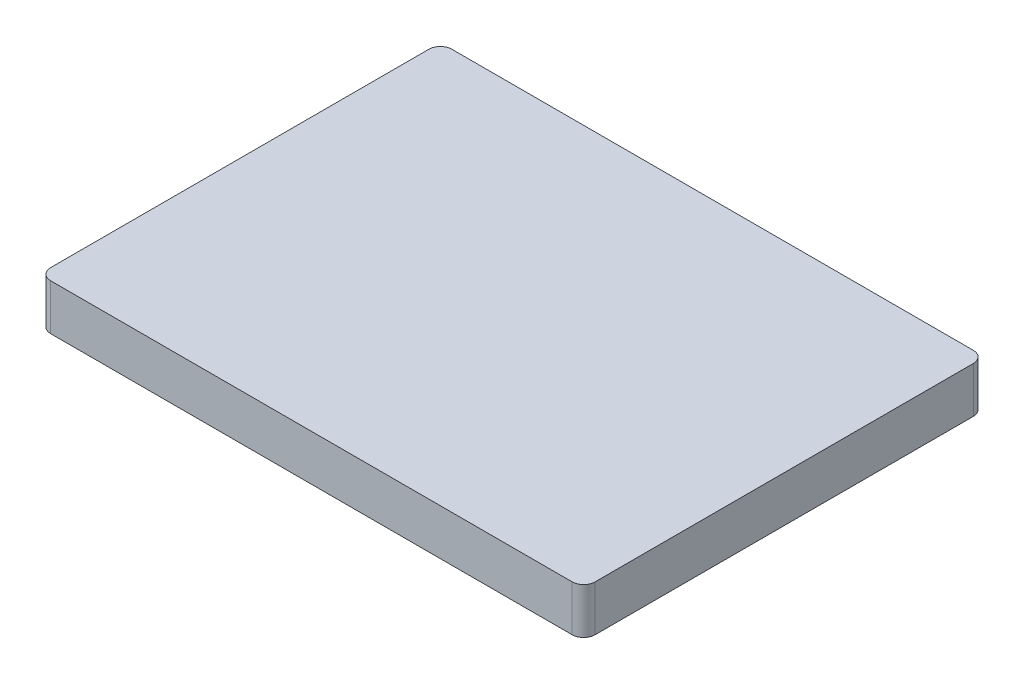
ISO-10303-21;
HEADER;
FILE_DESCRIPTION(('STEP AP214'),'2;1');
FILE_NAME('part.step','',(''),(''),'','','');
FILE_SCHEMA(('AUTOMOTIVE_DESIGN { 1 0 10303 214 1 1 1 1 }'));
ENDSEC;
DATA;
#1=APPLICATION_CONTEXT('core data for automotive mechanical design processes');
#2=APPLICATION_PROTOCOL_DEFINITION('international standard','automotive_design',2000,#1);
#3=PRODUCT_CONTEXT('',#1,'mechanical');
#4=PRODUCT('Part','Part','',(#3));
#5=PRODUCT_RELATED_PRODUCT_CATEGORY('part','',(#4));
#6=PRODUCT_DEFINITION_FORMATION('','',#4);
#7=PRODUCT_DEFINITION_CONTEXT('part definition',#1,'design');
#8=PRODUCT_DEFINITION('design','',#6,#7);
#9=PRODUCT_DEFINITION_SHAPE('','',#8);
#10=(LENGTH_UNIT() NAMED_UNIT(*) SI_UNIT(.MILLI.,.METRE.));
#11=(NAMED_UNIT(*) PLANE_ANGLE_UNIT() SI_UNIT($,.RADIAN.));
#12=(NAMED_UNIT(*) SI_UNIT($,.STERADIAN.) SOLID_ANGLE_UNIT());
#13=UNCERTAINTY_MEASURE_WITH_UNIT(LENGTH_MEASURE(1.E-05),#10,'distance_accuracy_value','');
#14=(GEOMETRIC_REPRESENTATION_CONTEXT(3) GLOBAL_UNCERTAINTY_ASSIGNED_CONTEXT((#13)) GLOBAL_UNIT_ASSIGNED_CONTEXT((#10,
#11,#12)) REPRESENTATION_CONTEXT('',''));
#15=CARTESIAN_POINT('',(0.,0.,0.));
#16=DIRECTION('',(0.,0.,1.));
#17=DIRECTION('',(1.,0.,0.));
#18=AXIS2_PLACEMENT_3D('',#15,#16,#17);
#19=CARTESIAN_POINT('',(2.,8.,-68.));
#20=DIRECTION('',(0.,-1.,0.));
#21=DIRECTION('',(0.,0.,-1.));
#22=AXIS2_PLACEMENT_3D('',#19,#20,#21);
#23=CYLINDRICAL_SURFACE('',#22,2.);
#24=CARTESIAN_POINT('',(2.,0.,-68.));
#25=DIRECTION('',(0.,1.,0.));
#26=DIRECTION('',(0.,0.,-1.));
#27=AXIS2_PLACEMENT_3D('',#24,#25,#26);
#28=CIRCLE('',#27,2.);
#29=CARTESIAN_POINT('',(2.00000000000001,0.,-70.));
#30=VERTEX_POINT('',#29);
#31=CARTESIAN_POINT('',(0.,0.,-68.));
#32=VERTEX_POINT('',#31);
#33=EDGE_CURVE('E129',#30,#32,#28,.T.);
#34=ORIENTED_EDGE('',*,*,#33,.T.);
#35=DIRECTION('',(0.,-1.,0.));
#36=VECTOR('',#35,1.);
#37=CARTESIAN_POINT('',(0.,8.,-68.));
#38=LINE('',#37,#36);
#39=CARTESIAN_POINT('',(0.,8.,-68.));
#40=VERTEX_POINT('',#39);
#41=EDGE_CURVE('E11',#40,#32,#38,.T.);
#42=ORIENTED_EDGE('',*,*,#41,.F.);
#43=CARTESIAN_POINT('',(2.,8.,-68.));
#44=DIRECTION('',(0.,1.,0.));
#45=DIRECTION('',(0.,0.,-1.));
#46=AXIS2_PLACEMENT_3D('',#43,#44,#45);
#47=CIRCLE('',#46,2.);
#48=CARTESIAN_POINT('',(2.00000000000001,8.,-70.));
#49=VERTEX_POINT('',#48);
#50=EDGE_CURVE('E143',#49,#40,#47,.T.);
#51=ORIENTED_EDGE('',*,*,#50,.F.);
#52=DIRECTION('',(0.,-1.,0.));
#53=VECTOR('',#52,1.);
#54=CARTESIAN_POINT('',(2.00000000000001,8.,-70.));
#55=LINE('',#54,#53);
#56=EDGE_CURVE('E125',#49,#30,#55,.T.);
#57=ORIENTED_EDGE('',*,*,#56,.T.);
#58=EDGE_LOOP('',(#34,#42,#51,#57));
#59=FACE_BOUND('',#58,.T.);
#60=ADVANCED_FACE('F33',(#59),#23,.T.);
#61=CARTESIAN_POINT('',(0.,8.,-68.));
#62=DIRECTION('',(1.,0.,0.));
#63=DIRECTION('',(0.,0.,-1.));
#64=AXIS2_PLACEMENT_3D('',#61,#62,#63);
#65=PLANE('',#64);
#66=DIRECTION('',(0.,0.,1.));
#67=VECTOR('',#66,1.);
#68=CARTESIAN_POINT('',(0.,0.,-68.));
#69=LINE('',#68,#67);
#70=CARTESIAN_POINT('',(0.,0.,-2.00000000000001));
#71=VERTEX_POINT('',#70);
#72=EDGE_CURVE('E132',#32,#71,#69,.T.);
#73=ORIENTED_EDGE('',*,*,#72,.T.);
#74=DIRECTION('',(0.,-1.,0.));
#75=VECTOR('',#74,1.);
#76=CARTESIAN_POINT('',(0.,8.,-2.00000000000001));
#77=LINE('',#76,#75);
#78=CARTESIAN_POINT('',(0.,8.,-2.00000000000001));
#79=VERTEX_POINT('',#78);
#80=EDGE_CURVE('E41',#79,#71,#77,.T.);
#81=ORIENTED_EDGE('',*,*,#80,.F.);
#82=DIRECTION('',(0.,0.,1.));
#83=VECTOR('',#82,1.);
#84=CARTESIAN_POINT('',(0.,8.,-68.));
#85=LINE('',#84,#83);
#86=EDGE_CURVE('E92',#40,#79,#85,.T.);
#87=ORIENTED_EDGE('',*,*,#86,.F.);
#88=ORIENTED_EDGE('',*,*,#41,.T.);
#89=EDGE_LOOP('',(#73,#81,#87,#88));
#90=FACE_BOUND('',#89,.T.);
#91=ADVANCED_FACE('F178',(#90),#65,.F.);
#92=CARTESIAN_POINT('',(2.,8.,-2.));
#93=DIRECTION('',(0.,-1.,0.));
#94=DIRECTION('',(0.,0.,-1.));
#95=AXIS2_PLACEMENT_3D('',#92,#93,#94);
#96=CYLINDRICAL_SURFACE('',#95,2.);
#97=CARTESIAN_POINT('',(2.,0.,-2.));
#98=DIRECTION('',(0.,1.,0.));
#99=DIRECTION('',(0.,0.,1.));
#100=AXIS2_PLACEMENT_3D('',#97,#98,#99);
#101=CIRCLE('',#100,2.);
#102=CARTESIAN_POINT('',(2.,0.,0.));
#103=VERTEX_POINT('',#102);
#104=EDGE_CURVE('E134',#71,#103,#101,.T.);
#105=ORIENTED_EDGE('',*,*,#104,.T.);
#106=DIRECTION('',(0.,-1.,0.));
#107=VECTOR('',#106,1.);
#108=CARTESIAN_POINT('',(2.,8.,0.));
#109=LINE('',#108,#107);
#110=CARTESIAN_POINT('',(2.,8.,0.));
#111=VERTEX_POINT('',#110);
#112=EDGE_CURVE('E150',#111,#103,#109,.T.);
#113=ORIENTED_EDGE('',*,*,#112,.F.);
#114=CARTESIAN_POINT('',(2.,8.,-2.));
#115=DIRECTION('',(0.,1.,0.));
#116=DIRECTION('',(0.,0.,1.));
#117=AXIS2_PLACEMENT_3D('',#114,#115,#116);
#118=CIRCLE('',#117,2.);
#119=EDGE_CURVE('E158',#79,#111,#118,.T.);
#120=ORIENTED_EDGE('',*,*,#119,.F.);
#121=ORIENTED_EDGE('',*,*,#80,.T.);
#122=EDGE_LOOP('',(#105,#113,#120,#121));
#123=FACE_BOUND('',#122,.T.);
#124=ADVANCED_FACE('F156',(#123),#96,.T.);
#125=CARTESIAN_POINT('',(2.00000000000001,8.,0.));
#126=DIRECTION('',(0.,0.,-1.));
#127=DIRECTION('',(-1.,0.,0.));
#128=AXIS2_PLACEMENT_3D('',#125,#126,#127);
#129=PLANE('',#128);
#130=DIRECTION('',(1.,0.,0.));
#131=VECTOR('',#130,1.);
#132=CARTESIAN_POINT('',(2.00000000000001,0.,0.));
#133=LINE('',#132,#131);
#134=CARTESIAN_POINT('',(93.,0.,0.));
#135=VERTEX_POINT('',#134);
#136=EDGE_CURVE('E136',#103,#135,#133,.T.);
#137=ORIENTED_EDGE('',*,*,#136,.T.);
#138=DIRECTION('',(0.,-1.,0.));
#139=VECTOR('',#138,1.);
#140=CARTESIAN_POINT('',(93.,8.,0.));
#141=LINE('',#140,#139);
#142=CARTESIAN_POINT('',(93.,8.,0.));
#143=VERTEX_POINT('',#142);
#144=EDGE_CURVE('E147',#143,#135,#141,.T.);
#145=ORIENTED_EDGE('',*,*,#144,.F.);
#146=DIRECTION('',(1.,0.,0.));
#147=VECTOR('',#146,1.);
#148=CARTESIAN_POINT('',(2.00000000000001,8.,0.));
#149=LINE('',#148,#147);
#150=EDGE_CURVE('E170',#111,#143,#149,.T.);
#151=ORIENTED_EDGE('',*,*,#150,.F.);
#152=ORIENTED_EDGE('',*,*,#112,.T.);
#153=EDGE_LOOP('',(#137,#145,#151,#152));
#154=FACE_BOUND('',#153,.T.);
#155=ADVANCED_FACE('F166',(#154),#129,.F.);
#156=CARTESIAN_POINT('',(93.,8.,-2.));
#157=DIRECTION('',(0.,-1.,0.));
#158=DIRECTION('',(0.,0.,-1.));
#159=AXIS2_PLACEMENT_3D('',#156,#157,#158);
#160=CYLINDRICAL_SURFACE('',#159,2.);
#161=CARTESIAN_POINT('',(93.,0.,-2.));
#162=DIRECTION('',(0.,1.,0.));
#163=DIRECTION('',(0.,0.,-1.));
#164=AXIS2_PLACEMENT_3D('',#161,#162,#163);
#165=CIRCLE('',#164,2.);
#166=CARTESIAN_POINT('',(95.,0.,-2.00000000000001));
#167=VERTEX_POINT('',#166);
#168=EDGE_CURVE('E138',#135,#167,#165,.T.);
#169=ORIENTED_EDGE('',*,*,#168,.T.);
#170=DIRECTION('',(0.,-1.,0.));
#171=VECTOR('',#170,1.);
#172=CARTESIAN_POINT('',(95.,8.,-2.00000000000001));
#173=LINE('',#172,#171);
#174=CARTESIAN_POINT('',(95.,8.,-2.00000000000001));
#175=VERTEX_POINT('',#174);
#176=EDGE_CURVE('E120',#175,#167,#173,.T.);
#177=ORIENTED_EDGE('',*,*,#176,.F.);
#178=CARTESIAN_POINT('',(93.,8.,-2.));
#179=DIRECTION('',(0.,1.,0.));
#180=DIRECTION('',(0.,0.,-1.));
#181=AXIS2_PLACEMENT_3D('',#178,#179,#180);
#182=CIRCLE('',#181,2.);
#183=EDGE_CURVE('E111',#143,#175,#182,.T.);
#184=ORIENTED_EDGE('',*,*,#183,.F.);
#185=ORIENTED_EDGE('',*,*,#144,.T.);
#186=EDGE_LOOP('',(#169,#177,#184,#185));
#187=FACE_BOUND('',#186,.T.);
#188=ADVANCED_FACE('F169',(#187),#160,.T.);
#189=CARTESIAN_POINT('',(95.,8.,-2.00000000000001));
#190=DIRECTION('',(-1.,0.,0.));
#191=DIRECTION('',(0.,0.,1.));
#192=AXIS2_PLACEMENT_3D('',#189,#190,#191);
#193=PLANE('',#192);
#194=DIRECTION('',(0.,0.,-1.));
#195=VECTOR('',#194,1.);
#196=CARTESIAN_POINT('',(95.,0.,-2.00000000000001));
#197=LINE('',#196,#195);
#198=CARTESIAN_POINT('',(95.,0.,-68.));
#199=VERTEX_POINT('',#198);
#200=EDGE_CURVE('E119',#167,#199,#197,.T.);
#201=ORIENTED_EDGE('',*,*,#200,.T.);
#202=DIRECTION('',(0.,-1.,0.));
#203=VECTOR('',#202,1.);
#204=CARTESIAN_POINT('',(95.,8.,-68.));
#205=LINE('',#204,#203);
#206=CARTESIAN_POINT('',(95.,8.,-68.));
#207=VERTEX_POINT('',#206);
#208=EDGE_CURVE('E116',#207,#199,#205,.T.);
#209=ORIENTED_EDGE('',*,*,#208,.F.);
#210=DIRECTION('',(0.,0.,-1.));
#211=VECTOR('',#210,1.);
#212=CARTESIAN_POINT('',(95.,8.,-2.00000000000001));
#213=LINE('',#212,#211);
#214=EDGE_CURVE('E105',#175,#207,#213,.T.);
#215=ORIENTED_EDGE('',*,*,#214,.F.);
#216=ORIENTED_EDGE('',*,*,#176,.T.);
#217=EDGE_LOOP('',(#201,#209,#215,#216));
#218=FACE_BOUND('',#217,.T.);
#219=ADVANCED_FACE('F117',(#218),#193,.F.);
#220=CARTESIAN_POINT('',(93.,8.,-68.));
#221=DIRECTION('',(0.,-1.,0.));
#222=DIRECTION('',(0.,0.,-1.));
#223=AXIS2_PLACEMENT_3D('',#220,#221,#222);
#224=CYLINDRICAL_SURFACE('',#223,2.);
#225=CARTESIAN_POINT('',(93.,0.,-68.));
#226=DIRECTION('',(0.,1.,0.));
#227=DIRECTION('',(0.,0.,-1.));
#228=AXIS2_PLACEMENT_3D('',#225,#226,#227);
#229=CIRCLE('',#228,2.);
#230=CARTESIAN_POINT('',(93.,0.,-70.));
#231=VERTEX_POINT('',#230);
#232=EDGE_CURVE('E78',#199,#231,#229,.T.);
#233=ORIENTED_EDGE('',*,*,#232,.T.);
#234=DIRECTION('',(0.,-1.,0.));
#235=VECTOR('',#234,1.);
#236=CARTESIAN_POINT('',(93.,8.,-70.));
#237=LINE('',#236,#235);
#238=CARTESIAN_POINT('',(93.,8.,-70.));
#239=VERTEX_POINT('',#238);
#240=EDGE_CURVE('E121',#239,#231,#237,.T.);
#241=ORIENTED_EDGE('',*,*,#240,.F.);
#242=CARTESIAN_POINT('',(93.,8.,-68.));
#243=DIRECTION('',(0.,1.,0.));
#244=DIRECTION('',(0.,0.,-1.));
#245=AXIS2_PLACEMENT_3D('',#242,#243,#244);
#246=CIRCLE('',#245,2.);
#247=EDGE_CURVE('E109',#207,#239,#246,.T.);
#248=ORIENTED_EDGE('',*,*,#247,.F.);
#249=ORIENTED_EDGE('',*,*,#208,.T.);
#250=EDGE_LOOP('',(#233,#241,#248,#249));
#251=FACE_BOUND('',#250,.T.);
#252=ADVANCED_FACE('F123',(#251),#224,.T.);
#253=CARTESIAN_POINT('',(93.,8.,-70.));
#254=DIRECTION('',(0.,0.,1.));
#255=DIRECTION('',(1.,0.,0.));
#256=AXIS2_PLACEMENT_3D('',#253,#254,#255);
#257=PLANE('',#256);
#258=DIRECTION('',(-1.,0.,0.));
#259=VECTOR('',#258,1.);
#260=CARTESIAN_POINT('',(93.,0.,-70.));
#261=LINE('',#260,#259);
#262=EDGE_CURVE('E84',#231,#30,#261,.T.);
#263=ORIENTED_EDGE('',*,*,#262,.T.);
#264=ORIENTED_EDGE('',*,*,#56,.F.);
#265=DIRECTION('',(-1.,0.,0.));
#266=VECTOR('',#265,1.);
#267=CARTESIAN_POINT('',(93.,8.,-70.));
#268=LINE('',#267,#266);
#269=EDGE_CURVE('E49',#239,#49,#268,.T.);
#270=ORIENTED_EDGE('',*,*,#269,.F.);
#271=ORIENTED_EDGE('',*,*,#240,.T.);
#272=EDGE_LOOP('',(#263,#264,#270,#271));
#273=FACE_BOUND('',#272,.T.);
#274=ADVANCED_FACE('F194',(#273),#257,.F.);
#275=CARTESIAN_POINT('',(2.,8.,-68.));
#276=DIRECTION('',(0.,-1.,0.));
#277=DIRECTION('',(0.,0.,-1.));
#278=AXIS2_PLACEMENT_3D('',#275,#276,#277);
#279=PLANE('',#278);
#280=ORIENTED_EDGE('',*,*,#50,.T.);
#281=ORIENTED_EDGE('',*,*,#86,.T.);
#282=ORIENTED_EDGE('',*,*,#119,.T.);
#283=ORIENTED_EDGE('',*,*,#150,.T.);
#284=ORIENTED_EDGE('',*,*,#183,.T.);
#285=ORIENTED_EDGE('',*,*,#214,.T.);
#286=ORIENTED_EDGE('',*,*,#247,.T.);
#287=ORIENTED_EDGE('',*,*,#269,.T.);
#288=EDGE_LOOP('',(#280,#281,#282,#283,#284,#285,#286,#287));
#289=FACE_BOUND('',#288,.T.);
#290=ADVANCED_FACE('F107',(#289),#279,.F.);
#291=CARTESIAN_POINT('',(2.,0.,-68.));
#292=DIRECTION('',(0.,-1.,0.));
#293=DIRECTION('',(0.,0.,-1.));
#294=AXIS2_PLACEMENT_3D('',#291,#292,#293);
#295=PLANE('',#294);
#296=ORIENTED_EDGE('',*,*,#33,.F.);
#297=ORIENTED_EDGE('',*,*,#262,.F.);
#298=ORIENTED_EDGE('',*,*,#232,.F.);
#299=ORIENTED_EDGE('',*,*,#200,.F.);
#300=ORIENTED_EDGE('',*,*,#168,.F.);
#301=ORIENTED_EDGE('',*,*,#136,.F.);
#302=ORIENTED_EDGE('',*,*,#104,.F.);
#303=ORIENTED_EDGE('',*,*,#72,.F.);
#304=EDGE_LOOP('',(#296,#297,#298,#299,#300,#301,#302,#303));
#305=FACE_BOUND('',#304,.T.);
#306=ADVANCED_FACE('F162',(#305),#295,.T.);
#307=CLOSED_SHELL('',(#60,#91,#124,#155,#188,#219,#252,#274,#290,#306));
#308=MANIFOLD_SOLID_BREP('B2',#307);
#309=ADVANCED_BREP_SHAPE_REPRESENTATION('',(#18,#308),#14);
#310=SHAPE_DEFINITION_REPRESENTATION(#9,#309);
ENDSEC;
END-ISO-10303-21;
